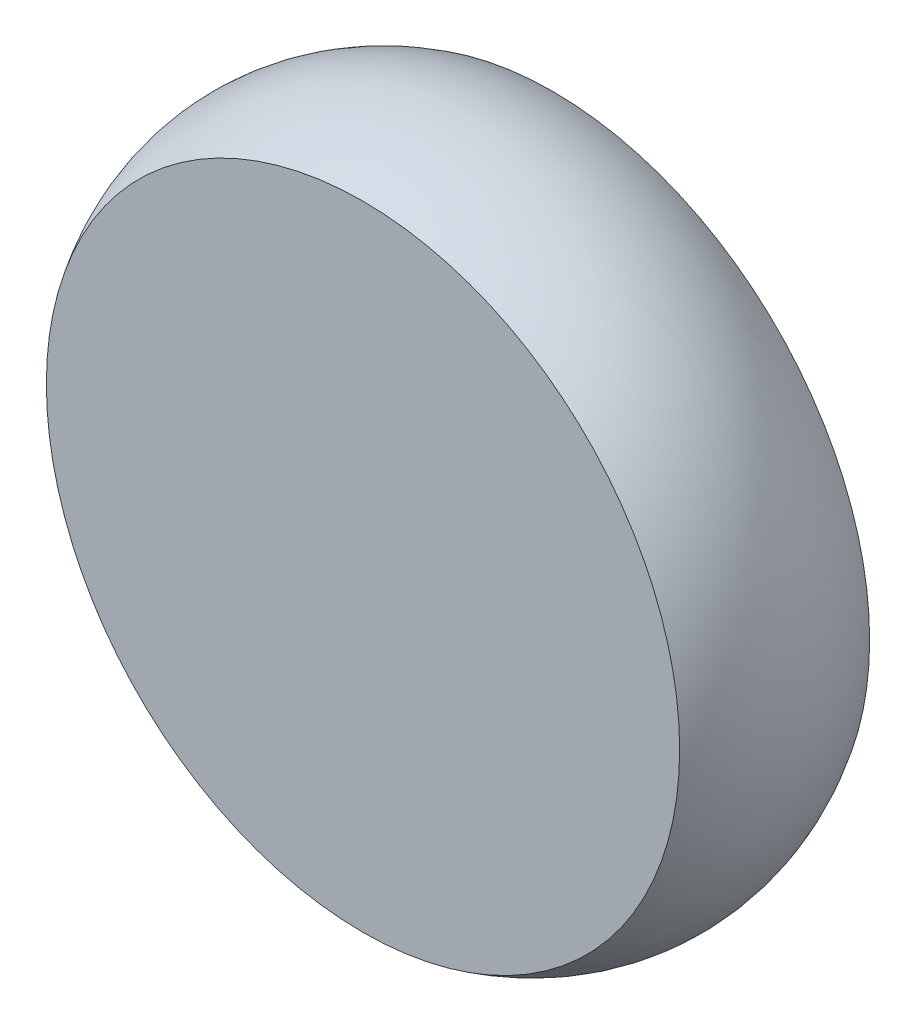
ISO-10303-21;
HEADER;
FILE_DESCRIPTION(('STEP AP214'),'2;1');
FILE_NAME('part.step','',(''),(''),'','','');
FILE_SCHEMA(('AUTOMOTIVE_DESIGN { 1 0 10303 214 1 1 1 1 }'));
ENDSEC;
DATA;
#1=APPLICATION_CONTEXT('core data for automotive mechanical design processes');
#2=APPLICATION_PROTOCOL_DEFINITION('international standard','automotive_design',2000,#1);
#3=PRODUCT_CONTEXT('',#1,'mechanical');
#4=PRODUCT('Part','Part','',(#3));
#5=PRODUCT_RELATED_PRODUCT_CATEGORY('part','',(#4));
#6=PRODUCT_DEFINITION_FORMATION('','',#4);
#7=PRODUCT_DEFINITION_CONTEXT('part definition',#1,'design');
#8=PRODUCT_DEFINITION('design','',#6,#7);
#9=PRODUCT_DEFINITION_SHAPE('','',#8);
#10=(LENGTH_UNIT() NAMED_UNIT(*) SI_UNIT(.MILLI.,.METRE.));
#11=(NAMED_UNIT(*) PLANE_ANGLE_UNIT() SI_UNIT($,.RADIAN.));
#12=(NAMED_UNIT(*) SI_UNIT($,.STERADIAN.) SOLID_ANGLE_UNIT());
#13=UNCERTAINTY_MEASURE_WITH_UNIT(LENGTH_MEASURE(1.E-05),#10,'distance_accuracy_value','');
#14=(GEOMETRIC_REPRESENTATION_CONTEXT(3) GLOBAL_UNCERTAINTY_ASSIGNED_CONTEXT((#13)) GLOBAL_UNIT_ASSIGNED_CONTEXT((#10,
#11,#12)) REPRESENTATION_CONTEXT('',''));
#15=CARTESIAN_POINT('',(0.,0.,0.));
#16=DIRECTION('',(0.,0.,1.));
#17=DIRECTION('',(1.,0.,0.));
#18=AXIS2_PLACEMENT_3D('',#15,#16,#17);
#19=CARTESIAN_POINT('',(0.,250.,-75.));
#20=DIRECTION('',(0.,0.,1.));
#21=DIRECTION('',(1.,0.,0.));
#22=AXIS2_PLACEMENT_3D('',#19,#20,#21);
#23=DEGENERATE_TOROIDAL_SURFACE('',#22,131.784095824631,140.,.T.);
#24=CARTESIAN_POINT('',(0.,250.,-150.));
#25=DIRECTION('',(0.,0.,1.));
#26=DIRECTION('',(1.,0.,0.));
#27=AXIS2_PLACEMENT_3D('',#24,#25,#26);
#28=CIRCLE('',#27,250.);
#29=CARTESIAN_POINT('',(250.,250.,-150.));
#30=VERTEX_POINT('',#29);
#31=EDGE_CURVE('E42',#30,#30,#28,.T.);
#32=ORIENTED_EDGE('',*,*,#31,.T.);
#33=EDGE_LOOP('',(#32));
#34=FACE_BOUND('',#33,.T.);
#35=CARTESIAN_POINT('',(0.,250.,0.));
#36=DIRECTION('',(0.,0.,1.));
#37=DIRECTION('',(1.,0.,0.));
#38=AXIS2_PLACEMENT_3D('',#35,#36,#37);
#39=CIRCLE('',#38,250.);
#40=CARTESIAN_POINT('',(250.,250.,0.));
#41=VERTEX_POINT('',#40);
#42=EDGE_CURVE('E61',#41,#41,#39,.T.);
#43=ORIENTED_EDGE('',*,*,#42,.F.);
#44=EDGE_LOOP('',(#43));
#45=FACE_BOUND('',#44,.T.);
#46=ADVANCED_FACE('F39',(#34,#45),#23,.T.);
#47=CARTESIAN_POINT('',(0.,0.,-150.));
#48=DIRECTION('',(0.,0.,-1.));
#49=DIRECTION('',(-1.,0.,0.));
#50=AXIS2_PLACEMENT_3D('',#47,#48,#49);
#51=PLANE('',#50);
#52=CARTESIAN_POINT('',(0.,250.,-150.));
#53=DIRECTION('',(0.,0.,1.));
#54=DIRECTION('',(1.,0.,0.));
#55=AXIS2_PLACEMENT_3D('',#52,#53,#54);
#56=CIRCLE('',#55,240.);
#57=CARTESIAN_POINT('',(240.,250.,-150.));
#58=VERTEX_POINT('',#57);
#59=EDGE_CURVE('E52',#58,#58,#56,.T.);
#60=ORIENTED_EDGE('',*,*,#59,.T.);
#61=EDGE_LOOP('',(#60));
#62=FACE_BOUND('',#61,.T.);
#63=ORIENTED_EDGE('',*,*,#31,.F.);
#64=EDGE_LOOP('',(#63));
#65=FACE_BOUND('',#64,.T.);
#66=ADVANCED_FACE('F76',(#62,#65),#51,.T.);
#67=CARTESIAN_POINT('',(0.,250.,0.));
#68=DIRECTION('',(0.,0.,1.));
#69=DIRECTION('',(1.,0.,0.));
#70=AXIS2_PLACEMENT_3D('',#67,#68,#69);
#71=CYLINDRICAL_SURFACE('',#70,240.);
#72=CARTESIAN_POINT('',(0.,250.,-6.00000000000003));
#73=DIRECTION('',(0.,0.,1.));
#74=DIRECTION('',(1.,0.,0.));
#75=AXIS2_PLACEMENT_3D('',#72,#73,#74);
#76=CIRCLE('',#75,240.);
#77=CARTESIAN_POINT('',(240.,250.,-6.00000000000003));
#78=VERTEX_POINT('',#77);
#79=EDGE_CURVE('E69',#78,#78,#76,.T.);
#80=ORIENTED_EDGE('',*,*,#79,.T.);
#81=EDGE_LOOP('',(#80));
#82=FACE_BOUND('',#81,.T.);
#83=ORIENTED_EDGE('',*,*,#59,.F.);
#84=EDGE_LOOP('',(#83));
#85=FACE_BOUND('',#84,.T.);
#86=ADVANCED_FACE('F79',(#82,#85),#71,.F.);
#87=CARTESIAN_POINT('',(0.,250.,-6.00000000000002));
#88=DIRECTION('',(0.,0.,-1.));
#89=DIRECTION('',(-1.,0.,0.));
#90=AXIS2_PLACEMENT_3D('',#87,#88,#89);
#91=PLANE('',#90);
#92=CARTESIAN_POINT('',(0.,250.,-6.00000000000002));
#93=DIRECTION('',(0.,0.,-1.));
#94=DIRECTION('',(-1.,0.,0.));
#95=AXIS2_PLACEMENT_3D('',#92,#93,#94);
#96=CIRCLE('',#95,50.);
#97=CARTESIAN_POINT('',(-50.,250.,-6.00000000000002));
#98=VERTEX_POINT('',#97);
#99=EDGE_CURVE('E62',#98,#98,#96,.T.);
#100=ORIENTED_EDGE('',*,*,#99,.F.);
#101=EDGE_LOOP('',(#100));
#102=FACE_BOUND('',#101,.T.);
#103=ORIENTED_EDGE('',*,*,#79,.F.);
#104=EDGE_LOOP('',(#103));
#105=FACE_BOUND('',#104,.T.);
#106=ADVANCED_FACE('F81',(#102,#105),#91,.T.);
#107=CARTESIAN_POINT('',(0.,0.,0.));
#108=DIRECTION('',(0.,0.,1.));
#109=DIRECTION('',(1.,0.,0.));
#110=AXIS2_PLACEMENT_3D('',#107,#108,#109);
#111=PLANE('',#110);
#112=ORIENTED_EDGE('',*,*,#42,.T.);
#113=EDGE_LOOP('',(#112));
#114=FACE_BOUND('',#113,.T.);
#115=ADVANCED_FACE('F89',(#114),#111,.T.);
#116=CARTESIAN_POINT('',(0.,250.,-106.));
#117=DIRECTION('',(0.,0.,1.));
#118=DIRECTION('',(1.,0.,0.));
#119=AXIS2_PLACEMENT_3D('',#116,#117,#118);
#120=CYLINDRICAL_SURFACE('',#119,50.);
#121=CARTESIAN_POINT('',(0.,250.,-106.));
#122=DIRECTION('',(0.,0.,-1.));
#123=DIRECTION('',(-1.,0.,0.));
#124=AXIS2_PLACEMENT_3D('',#121,#122,#123);
#125=CIRCLE('',#124,50.);
#126=CARTESIAN_POINT('',(-50.,250.,-106.));
#127=VERTEX_POINT('',#126);
#128=EDGE_CURVE('E57',#127,#127,#125,.T.);
#129=ORIENTED_EDGE('',*,*,#128,.F.);
#130=EDGE_LOOP('',(#129));
#131=FACE_BOUND('',#130,.T.);
#132=ORIENTED_EDGE('',*,*,#99,.T.);
#133=EDGE_LOOP('',(#132));
#134=FACE_BOUND('',#133,.T.);
#135=ADVANCED_FACE('F101',(#131,#134),#120,.T.);
#136=CARTESIAN_POINT('',(0.,250.,-106.));
#137=DIRECTION('',(0.,0.,-1.));
#138=DIRECTION('',(-1.,0.,0.));
#139=AXIS2_PLACEMENT_3D('',#136,#137,#138);
#140=PLANE('',#139);
#141=CARTESIAN_POINT('',(0.,250.,-106.));
#142=DIRECTION('',(0.,0.,-1.));
#143=DIRECTION('',(-1.,0.,0.));
#144=AXIS2_PLACEMENT_3D('',#141,#142,#143);
#145=CIRCLE('',#144,30.);
#146=CARTESIAN_POINT('',(-30.,250.,-106.));
#147=VERTEX_POINT('',#146);
#148=EDGE_CURVE('E10',#147,#147,#145,.T.);
#149=ORIENTED_EDGE('',*,*,#148,.F.);
#150=EDGE_LOOP('',(#149));
#151=FACE_BOUND('',#150,.T.);
#152=ORIENTED_EDGE('',*,*,#128,.T.);
#153=EDGE_LOOP('',(#152));
#154=FACE_BOUND('',#153,.T.);
#155=ADVANCED_FACE('F106',(#151,#154),#140,.T.);
#156=CARTESIAN_POINT('',(0.,250.,-156.));
#157=DIRECTION('',(0.,0.,1.));
#158=DIRECTION('',(1.,0.,0.));
#159=AXIS2_PLACEMENT_3D('',#156,#157,#158);
#160=CYLINDRICAL_SURFACE('',#159,30.);
#161=CARTESIAN_POINT('',(0.,250.,-156.));
#162=DIRECTION('',(0.,0.,-1.));
#163=DIRECTION('',(-1.,0.,0.));
#164=AXIS2_PLACEMENT_3D('',#161,#162,#163);
#165=CIRCLE('',#164,30.);
#166=CARTESIAN_POINT('',(-30.,250.,-156.));
#167=VERTEX_POINT('',#166);
#168=EDGE_CURVE('E55',#167,#167,#165,.T.);
#169=ORIENTED_EDGE('',*,*,#168,.F.);
#170=EDGE_LOOP('',(#169));
#171=FACE_BOUND('',#170,.T.);
#172=ORIENTED_EDGE('',*,*,#148,.T.);
#173=EDGE_LOOP('',(#172));
#174=FACE_BOUND('',#173,.T.);
#175=ADVANCED_FACE('F112',(#171,#174),#160,.T.);
#176=CARTESIAN_POINT('',(0.,250.,-156.));
#177=DIRECTION('',(0.,0.,-1.));
#178=DIRECTION('',(-1.,0.,0.));
#179=AXIS2_PLACEMENT_3D('',#176,#177,#178);
#180=PLANE('',#179);
#181=CARTESIAN_POINT('',(0.,250.,-156.));
#182=DIRECTION('',(0.,0.,-1.));
#183=DIRECTION('',(-1.,0.,0.));
#184=AXIS2_PLACEMENT_3D('',#181,#182,#183);
#185=CIRCLE('',#184,20.);
#186=CARTESIAN_POINT('',(-20.,250.,-156.));
#187=VERTEX_POINT('',#186);
#188=EDGE_CURVE('E134',#187,#187,#185,.T.);
#189=ORIENTED_EDGE('',*,*,#188,.F.);
#190=EDGE_LOOP('',(#189));
#191=FACE_BOUND('',#190,.T.);
#192=ORIENTED_EDGE('',*,*,#168,.T.);
#193=EDGE_LOOP('',(#192));
#194=FACE_BOUND('',#193,.T.);
#195=ADVANCED_FACE('F116',(#191,#194),#180,.T.);
#196=CARTESIAN_POINT('',(0.,250.,-126.));
#197=DIRECTION('',(0.,0.,-1.));
#198=DIRECTION('',(-1.,0.,0.));
#199=AXIS2_PLACEMENT_3D('',#196,#197,#198);
#200=CYLINDRICAL_SURFACE('',#199,20.);
#201=CARTESIAN_POINT('',(0.,250.,-126.));
#202=DIRECTION('',(0.,0.,-1.));
#203=DIRECTION('',(-1.,0.,0.));
#204=AXIS2_PLACEMENT_3D('',#201,#202,#203);
#205=CIRCLE('',#204,20.);
#206=CARTESIAN_POINT('',(-20.,250.,-126.));
#207=VERTEX_POINT('',#206);
#208=EDGE_CURVE('E132',#207,#207,#205,.T.);
#209=ORIENTED_EDGE('',*,*,#208,.F.);
#210=EDGE_LOOP('',(#209));
#211=FACE_BOUND('',#210,.T.);
#212=ORIENTED_EDGE('',*,*,#188,.T.);
#213=EDGE_LOOP('',(#212));
#214=FACE_BOUND('',#213,.T.);
#215=ADVANCED_FACE('F120',(#211,#214),#200,.F.);
#216=CARTESIAN_POINT('',(0.,250.,-126.));
#217=DIRECTION('',(0.,0.,-1.));
#218=DIRECTION('',(-1.,0.,0.));
#219=AXIS2_PLACEMENT_3D('',#216,#217,#218);
#220=PLANE('',#219);
#221=ORIENTED_EDGE('',*,*,#208,.T.);
#222=EDGE_LOOP('',(#221));
#223=FACE_BOUND('',#222,.T.);
#224=ADVANCED_FACE('F124',(#223),#220,.T.);
#225=CLOSED_SHELL('',(#46,#66,#86,#106,#115,#135,#155,#175,#195,#215,#224));
#226=MANIFOLD_SOLID_BREP('B2',#225);
#227=ADVANCED_BREP_SHAPE_REPRESENTATION('',(#18,#226),#14);
#228=SHAPE_DEFINITION_REPRESENTATION(#9,#227);
ENDSEC;
END-ISO-10303-21;
